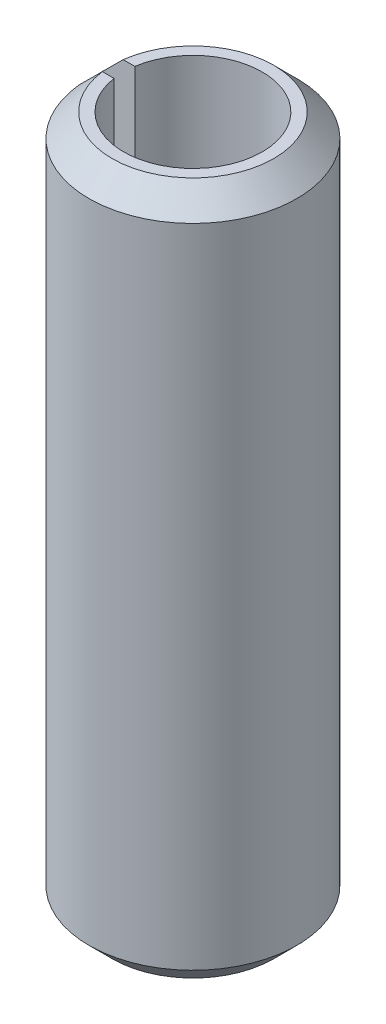
ISO-10303-21;
HEADER;
FILE_DESCRIPTION(('STEP AP214'),'2;1');
FILE_NAME('part.step','',(''),(''),'','','');
FILE_SCHEMA(('AUTOMOTIVE_DESIGN { 1 0 10303 214 1 1 1 1 }'));
ENDSEC;
DATA;
#1=APPLICATION_CONTEXT('core data for automotive mechanical design processes');
#2=APPLICATION_PROTOCOL_DEFINITION('international standard','automotive_design',2000,#1);
#3=PRODUCT_CONTEXT('',#1,'mechanical');
#4=PRODUCT('Part','Part','',(#3));
#5=PRODUCT_RELATED_PRODUCT_CATEGORY('part','',(#4));
#6=PRODUCT_DEFINITION_FORMATION('','',#4);
#7=PRODUCT_DEFINITION_CONTEXT('part definition',#1,'design');
#8=PRODUCT_DEFINITION('design','',#6,#7);
#9=PRODUCT_DEFINITION_SHAPE('','',#8);
#10=(LENGTH_UNIT() NAMED_UNIT(*) SI_UNIT(.MILLI.,.METRE.));
#11=(NAMED_UNIT(*) PLANE_ANGLE_UNIT() SI_UNIT($,.RADIAN.));
#12=(NAMED_UNIT(*) SI_UNIT($,.STERADIAN.) SOLID_ANGLE_UNIT());
#13=UNCERTAINTY_MEASURE_WITH_UNIT(LENGTH_MEASURE(1.E-05),#10,'distance_accuracy_value','');
#14=(GEOMETRIC_REPRESENTATION_CONTEXT(3) GLOBAL_UNCERTAINTY_ASSIGNED_CONTEXT((#13)) GLOBAL_UNIT_ASSIGNED_CONTEXT((#10,
#11,#12)) REPRESENTATION_CONTEXT('',''));
#15=CARTESIAN_POINT('',(0.,0.,0.));
#16=DIRECTION('',(0.,0.,1.));
#17=DIRECTION('',(1.,0.,0.));
#18=AXIS2_PLACEMENT_3D('',#15,#16,#17);
#19=CARTESIAN_POINT('',(2.,10.,0.));
#20=DIRECTION('',(0.,-1.,0.));
#21=DIRECTION('',(0.,0.,-1.));
#22=AXIS2_PLACEMENT_3D('',#19,#20,#21);
#23=PLANE('',#22);
#24=CARTESIAN_POINT('',(0.,10.,0.));
#25=DIRECTION('',(0.,-1.,0.));
#26=DIRECTION('',(0.,0.,-1.));
#27=AXIS2_PLACEMENT_3D('',#24,#25,#26);
#28=CIRCLE('',#27,2.33333333333333);
#29=CARTESIAN_POINT('',(-2.31396725224115,10.,0.3));
#30=VERTEX_POINT('',#29);
#31=CARTESIAN_POINT('',(-2.31396725224115,10.,-0.3));
#32=VERTEX_POINT('',#31);
#33=EDGE_CURVE('E111',#30,#32,#28,.F.);
#34=ORIENTED_EDGE('',*,*,#33,.T.);
#35=DIRECTION('',(-1.,0.,0.));
#36=VECTOR('',#35,1.);
#37=CARTESIAN_POINT('',(0.,10.,-0.3));
#38=LINE('',#37,#36);
#39=CARTESIAN_POINT('',(-1.97737199332852,10.,-0.3));
#40=VERTEX_POINT('',#39);
#41=EDGE_CURVE('E161',#40,#32,#38,.T.);
#42=ORIENTED_EDGE('',*,*,#41,.F.);
#43=CARTESIAN_POINT('',(0.,10.,0.));
#44=DIRECTION('',(0.,1.,0.));
#45=DIRECTION('',(0.,0.,1.));
#46=AXIS2_PLACEMENT_3D('',#43,#44,#45);
#47=CIRCLE('',#46,2.);
#48=CARTESIAN_POINT('',(-1.97737199332852,10.,0.3));
#49=VERTEX_POINT('',#48);
#50=EDGE_CURVE('E107',#49,#40,#47,.T.);
#51=ORIENTED_EDGE('',*,*,#50,.F.);
#52=DIRECTION('',(1.,0.,0.));
#53=VECTOR('',#52,1.);
#54=CARTESIAN_POINT('',(0.,10.,0.3));
#55=LINE('',#54,#53);
#56=EDGE_CURVE('E98',#30,#49,#55,.T.);
#57=ORIENTED_EDGE('',*,*,#56,.F.);
#58=EDGE_LOOP('',(#34,#42,#51,#57));
#59=FACE_BOUND('',#58,.T.);
#60=ADVANCED_FACE('F34',(#59),#23,.F.);
#61=CARTESIAN_POINT('',(0.,10.,0.));
#62=DIRECTION('',(0.,1.,0.));
#63=DIRECTION('',(0.,0.,1.));
#64=AXIS2_PLACEMENT_3D('',#61,#62,#63);
#65=CYLINDRICAL_SURFACE('',#64,3.);
#66=CARTESIAN_POINT('',(0.,-9.33333333333333,0.));
#67=DIRECTION('',(0.,1.,0.));
#68=DIRECTION('',(0.,0.,1.));
#69=AXIS2_PLACEMENT_3D('',#66,#67,#68);
#70=CIRCLE('',#69,3.);
#71=CARTESIAN_POINT('',(-2.98496231131986,-9.33333333333333,0.3));
#72=VERTEX_POINT('',#71);
#73=CARTESIAN_POINT('',(-2.98496231131986,-9.33333333333333,-0.3));
#74=VERTEX_POINT('',#73);
#75=EDGE_CURVE('E114',#72,#74,#70,.T.);
#76=ORIENTED_EDGE('',*,*,#75,.T.);
#77=DIRECTION('',(0.,1.,0.));
#78=VECTOR('',#77,1.);
#79=CARTESIAN_POINT('',(-2.98496231131986,10.,-0.3));
#80=LINE('',#79,#78);
#81=CARTESIAN_POINT('',(-2.98496231131986,9.33333333333333,-0.3));
#82=VERTEX_POINT('',#81);
#83=EDGE_CURVE('E53',#74,#82,#80,.T.);
#84=ORIENTED_EDGE('',*,*,#83,.T.);
#85=CARTESIAN_POINT('',(0.,9.33333333333333,0.));
#86=DIRECTION('',(0.,-1.,0.));
#87=DIRECTION('',(0.,0.,-1.));
#88=AXIS2_PLACEMENT_3D('',#85,#86,#87);
#89=CIRCLE('',#88,3.);
#90=CARTESIAN_POINT('',(-2.98496231131986,9.33333333333333,0.3));
#91=VERTEX_POINT('',#90);
#92=EDGE_CURVE('E120',#82,#91,#89,.T.);
#93=ORIENTED_EDGE('',*,*,#92,.T.);
#94=DIRECTION('',(0.,1.,0.));
#95=VECTOR('',#94,1.);
#96=CARTESIAN_POINT('',(-2.98496231131986,10.,0.3));
#97=LINE('',#96,#95);
#98=EDGE_CURVE('E142',#91,#72,#97,.F.);
#99=ORIENTED_EDGE('',*,*,#98,.T.);
#100=EDGE_LOOP('',(#76,#84,#93,#99));
#101=FACE_BOUND('',#100,.T.);
#102=ADVANCED_FACE('F167',(#101),#65,.T.);
#103=CARTESIAN_POINT('',(3.,-10.,0.));
#104=DIRECTION('',(0.,1.,0.));
#105=DIRECTION('',(0.,0.,1.));
#106=AXIS2_PLACEMENT_3D('',#103,#104,#105);
#107=PLANE('',#106);
#108=CARTESIAN_POINT('',(0.,-10.,0.));
#109=DIRECTION('',(0.,1.,0.));
#110=DIRECTION('',(0.,0.,1.));
#111=AXIS2_PLACEMENT_3D('',#108,#109,#110);
#112=CIRCLE('',#111,2.);
#113=CARTESIAN_POINT('',(-1.97737199332852,-10.,0.3));
#114=VERTEX_POINT('',#113);
#115=CARTESIAN_POINT('',(-1.97737199332852,-10.,-0.3));
#116=VERTEX_POINT('',#115);
#117=EDGE_CURVE('E105',#114,#116,#112,.T.);
#118=ORIENTED_EDGE('',*,*,#117,.T.);
#119=DIRECTION('',(-1.,0.,0.));
#120=VECTOR('',#119,1.);
#121=CARTESIAN_POINT('',(0.,-10.,-0.3));
#122=LINE('',#121,#120);
#123=CARTESIAN_POINT('',(-2.31396725224114,-10.,-0.3));
#124=VERTEX_POINT('',#123);
#125=EDGE_CURVE('E89',#116,#124,#122,.T.);
#126=ORIENTED_EDGE('',*,*,#125,.T.);
#127=CARTESIAN_POINT('',(0.,-10.,0.));
#128=DIRECTION('',(0.,1.,0.));
#129=DIRECTION('',(0.,0.,1.));
#130=AXIS2_PLACEMENT_3D('',#127,#128,#129);
#131=CIRCLE('',#130,2.33333333333333);
#132=CARTESIAN_POINT('',(-2.31396725224114,-10.,0.3));
#133=VERTEX_POINT('',#132);
#134=EDGE_CURVE('E123',#124,#133,#131,.F.);
#135=ORIENTED_EDGE('',*,*,#134,.T.);
#136=DIRECTION('',(1.,0.,0.));
#137=VECTOR('',#136,1.);
#138=CARTESIAN_POINT('',(0.,-10.,0.3));
#139=LINE('',#138,#137);
#140=EDGE_CURVE('E61',#133,#114,#139,.T.);
#141=ORIENTED_EDGE('',*,*,#140,.T.);
#142=EDGE_LOOP('',(#118,#126,#135,#141));
#143=FACE_BOUND('',#142,.T.);
#144=ADVANCED_FACE('F110',(#143),#107,.F.);
#145=CARTESIAN_POINT('',(0.,10.,0.));
#146=DIRECTION('',(0.,1.,0.));
#147=DIRECTION('',(0.,0.,1.));
#148=AXIS2_PLACEMENT_3D('',#145,#146,#147);
#149=CYLINDRICAL_SURFACE('',#148,2.);
#150=ORIENTED_EDGE('',*,*,#50,.T.);
#151=DIRECTION('',(0.,1.,0.));
#152=VECTOR('',#151,1.);
#153=CARTESIAN_POINT('',(-1.97737199332852,10.,-0.3));
#154=LINE('',#153,#152);
#155=EDGE_CURVE('E92',#40,#116,#154,.F.);
#156=ORIENTED_EDGE('',*,*,#155,.T.);
#157=ORIENTED_EDGE('',*,*,#117,.F.);
#158=DIRECTION('',(0.,1.,0.));
#159=VECTOR('',#158,1.);
#160=CARTESIAN_POINT('',(-1.97737199332852,10.,0.3));
#161=LINE('',#160,#159);
#162=EDGE_CURVE('E141',#114,#49,#161,.T.);
#163=ORIENTED_EDGE('',*,*,#162,.T.);
#164=EDGE_LOOP('',(#150,#156,#157,#163));
#165=FACE_BOUND('',#164,.T.);
#166=ADVANCED_FACE('F103',(#165),#149,.F.);
#167=CARTESIAN_POINT('',(0.,10.,0.));
#168=DIRECTION('',(0.,-1.,0.));
#169=DIRECTION('',(0.,0.,-1.));
#170=AXIS2_PLACEMENT_3D('',#167,#168,#169);
#171=CONICAL_SURFACE('',#170,2.33333333333333,0.785398163397447);
#172=CARTESIAN_POINT('',(-0.396691641849987,11.8359760586166,-0.3));
#173=CARTESIAN_POINT('',(-0.415710442544804,11.8207951156941,-0.3));
#174=CARTESIAN_POINT('',(-0.434545305922699,11.8053883420681,-0.3));
#175=CARTESIAN_POINT('',(-0.471921092021415,11.774226655868,-0.3));
#176=CARTESIAN_POINT('',(-0.490462053368463,11.7584717897047,-0.3));
#177=CARTESIAN_POINT('',(-0.545749728417863,11.7108450901463,-0.3));
#178=CARTESIAN_POINT('',(-0.582174229450623,11.6786005580013,-0.3));
#179=CARTESIAN_POINT('',(-0.654481105811685,11.6135420397666,-0.3));
#180=CARTESIAN_POINT('',(-0.690363688883504,11.580728282816,-0.3));
#181=CARTESIAN_POINT('',(-0.761783051490791,11.514719062787,-0.3));
#182=CARTESIAN_POINT('',(-0.797319790978148,11.4815235564512,-0.3));
#183=CARTESIAN_POINT('',(-0.90940734835268,11.3760800093661,-0.3));
#184=CARTESIAN_POINT('',(-0.9855258486054,11.3033733790761,-0.3));
#185=CARTESIAN_POINT('',(-1.13721263824695,11.1573878763704,-0.3));
#186=CARTESIAN_POINT('',(-1.21278091388571,11.0841089897483,-0.3));
#187=CARTESIAN_POINT('',(-1.43901501770103,10.8637908164948,-0.3));
#188=CARTESIAN_POINT('',(-1.58921089074383,10.7162692812486,-0.3));
#189=CARTESIAN_POINT('',(-1.88920528336474,10.4206128098025,-0.3));
#190=CARTESIAN_POINT('',(-2.0390034459924,10.272477513039,-0.3));
#191=CARTESIAN_POINT('',(-2.3383233202977,9.97593275341402,-0.3));
#192=CARTESIAN_POINT('',(-2.4878450366432,9.82752329526806,-0.3));
#193=CARTESIAN_POINT('',(-2.82121021974059,9.49629260228929,-0.3));
#194=CARTESIAN_POINT('',(-3.00501381207356,9.31343127593677,-0.3));
#195=CARTESIAN_POINT('',(-3.37248742703612,8.94757211088701,-0.3));
#196=CARTESIAN_POINT('',(-3.55615744880257,8.76457427132283,-0.3));
#197=CARTESIAN_POINT('',(-3.92322849028451,8.39867890361921,-0.3));
#198=CARTESIAN_POINT('',(-4.10662959454422,8.21578146027513,-0.3));
#199=CARTESIAN_POINT('',(-4.47337250984641,7.84992967162319,-0.3));
#200=CARTESIAN_POINT('',(-4.6567143212905,7.66697532671794,-0.3));
#201=CARTESIAN_POINT('',(-4.84003998644652,7.48400481585782,-0.3));
#202=B_SPLINE_CURVE_WITH_KNOTS('',3,(#172,#173,#174,#175,#176,#177,#178,#179,#180,#181,#182,
#183,#184,#185,#186,#187,#188,#189,#190,#191,#192,#193,#194,#195,#196,#197,#198,#199,#200,#201),
.UNSPECIFIED.,.F.,.F.,(4,2,2,2,2,2,2,2,2,2,2,2,2,2,4),(0.,0.0729980751688486,0.145986475627374,
0.291912989694833,0.437782065450063,0.583667836282376,0.899448949933818,1.21523792803044,
1.8468126948339,2.47883496482001,3.1108464636669,3.88866272697381,4.66648397263536,
5.44352125628224,6.2205531617089),.UNSPECIFIED.);
#203=EDGE_CURVE('E108',#32,#82,#202,.T.);
#204=ORIENTED_EDGE('',*,*,#203,.F.);
#205=ORIENTED_EDGE('',*,*,#33,.F.);
#206=CARTESIAN_POINT('',(-4.84003998644652,7.48400481585782,0.3));
#207=CARTESIAN_POINT('',(-4.65661166983822,7.66707762611222,0.3));
#208=CARTESIAN_POINT('',(-4.47316729946414,7.85013437041129,0.3));
#209=CARTESIAN_POINT('',(-4.10622546332719,8.21618461855336,0.3));
#210=CARTESIAN_POINT('',(-3.92272799914974,8.39917812398572,0.3));
#211=CARTESIAN_POINT('',(-3.55566279037501,8.76506701356655,0.3));
#212=CARTESIAN_POINT('',(-3.37209505210493,8.9479624040621,0.3));
#213=CARTESIAN_POINT('',(-3.00482090267688,9.31362369394764,0.3));
#214=CARTESIAN_POINT('',(-2.82111448797139,9.49638958977595,0.3));
#215=CARTESIAN_POINT('',(-2.54536236794638,9.77037330481986,0.3));
#216=CARTESIAN_POINT('',(-2.45340575586346,9.86168077976633,0.3));
#217=CARTESIAN_POINT('',(-2.26940960484188,10.0442102220244,0.3));
#218=CARTESIAN_POINT('',(-2.17737006678163,10.1354321902212,0.3));
#219=CARTESIAN_POINT('',(-1.99317828428106,10.3177473756332,0.3));
#220=CARTESIAN_POINT('',(-1.90102604959158,10.4088406026945,0.3));
#221=CARTESIAN_POINT('',(-1.71653521416962,10.5908450855826,0.3));
#222=CARTESIAN_POINT('',(-1.62419660658486,10.6817563344646,0.3));
#223=CARTESIAN_POINT('',(-1.43920140486478,10.8633069986035,0.3));
#224=CARTESIAN_POINT('',(-1.34654472924561,10.9539463309988,0.3));
#225=CARTESIAN_POINT('',(-1.20716868742077,11.0894915879573,0.3));
#226=CARTESIAN_POINT('',(-1.16064781788948,11.1346015166217,0.3));
#227=CARTESIAN_POINT('',(-1.06741554452681,11.224627968537,0.3));
#228=CARTESIAN_POINT('',(-1.02070413330827,11.2695444841479,0.3));
#229=CARTESIAN_POINT('',(-0.926985622564411,11.3591095758161,0.3));
#230=CARTESIAN_POINT('',(-0.879978402076291,11.4037580254008,0.3));
#231=CARTESIAN_POINT('',(-0.785547702947314,11.4926043735142,0.3));
#232=CARTESIAN_POINT('',(-0.73812427015481,11.5368023205373,0.3));
#233=CARTESIAN_POINT('',(-0.666448951732278,11.6025358600644,0.3));
#234=CARTESIAN_POINT('',(-0.642460918100559,11.6243586774786,0.3));
#235=CARTESIAN_POINT('',(-0.594246640374244,11.6677369343593,0.3));
#236=CARTESIAN_POINT('',(-0.570020410298657,11.6892923893946,0.3));
#237=CARTESIAN_POINT('',(-0.521236271316189,11.7320465523289,0.3));
#238=CARTESIAN_POINT('',(-0.496678237792463,11.7532451190751,0.3));
#239=CARTESIAN_POINT('',(-0.447082056781348,11.7950819333039,0.3));
#240=CARTESIAN_POINT('',(-0.422043811893213,11.8157200650187,0.3));
#241=CARTESIAN_POINT('',(-0.396691641849987,11.8359760586166,0.3));
#242=B_SPLINE_CURVE_WITH_KNOTS('',3,(#206,#207,#208,#209,#210,#211,#212,#213,#214,#215,#216,
#217,#218,#219,#220,#221,#222,#223,#224,#225,#226,#227,#228,#229,#230,#231,#232,#233,#234,#235,
#236,#237,#238,#239,#240,#241),.UNSPECIFIED.,.F.,.F.,(4,2,2,2,2,2,2,2,2,2,2,2,2,2,2,2,2,4),(0.,
0.777466682643027,1.55491215039541,2.33229911905273,3.10970669808068,3.49847093359981,
3.88723109831565,4.27595971937198,4.66470290288618,5.05355447767748,5.2479554446632,
5.44236402147155,5.63685806419796,5.83133094459473,5.92861738853459,6.02589814057093,
6.12321650465721,6.22055482096147),.UNSPECIFIED.);
#243=EDGE_CURVE('E135',#91,#30,#242,.T.);
#244=ORIENTED_EDGE('',*,*,#243,.F.);
#245=ORIENTED_EDGE('',*,*,#92,.F.);
#246=EDGE_LOOP('',(#204,#205,#244,#245));
#247=FACE_BOUND('',#246,.T.);
#248=ADVANCED_FACE('F145',(#247),#171,.T.);
#249=CARTESIAN_POINT('',(0.,-9.33333333333333,0.));
#250=DIRECTION('',(0.,1.,0.));
#251=DIRECTION('',(0.,0.,1.));
#252=AXIS2_PLACEMENT_3D('',#249,#250,#251);
#253=CONICAL_SURFACE('',#252,3.,0.785398163397451);
#254=CARTESIAN_POINT('',(-4.84003998644652,-7.48400481585783,-0.3));
#255=CARTESIAN_POINT('',(-4.65661166983822,-7.66707762611223,-0.3));
#256=CARTESIAN_POINT('',(-4.47316729946414,-7.8501343704113,-0.3));
#257=CARTESIAN_POINT('',(-4.10622546332719,-8.21618461855337,-0.3));
#258=CARTESIAN_POINT('',(-3.92272799914974,-8.39917812398572,-0.3));
#259=CARTESIAN_POINT('',(-3.55566279037501,-8.76506701356655,-0.3));
#260=CARTESIAN_POINT('',(-3.37209505210493,-8.9479624040621,-0.3));
#261=CARTESIAN_POINT('',(-3.00482090267688,-9.31362369394764,-0.3));
#262=CARTESIAN_POINT('',(-2.82111448797139,-9.49638958977595,-0.3));
#263=CARTESIAN_POINT('',(-2.54536236794638,-9.77037330481986,-0.3));
#264=CARTESIAN_POINT('',(-2.45340575586347,-9.86168077976633,-0.3));
#265=CARTESIAN_POINT('',(-2.26940960484188,-10.0442102220243,-0.3));
#266=CARTESIAN_POINT('',(-2.17737006678163,-10.1354321902212,-0.3));
#267=CARTESIAN_POINT('',(-1.99317828428106,-10.3177473756332,-0.3));
#268=CARTESIAN_POINT('',(-1.90102604959158,-10.4088406026945,-0.3));
#269=CARTESIAN_POINT('',(-1.71653521416962,-10.5908450855825,-0.3));
#270=CARTESIAN_POINT('',(-1.62419660658486,-10.6817563344646,-0.3));
#271=CARTESIAN_POINT('',(-1.43920140486478,-10.8633069986035,-0.3));
#272=CARTESIAN_POINT('',(-1.3465447292456,-10.9539463309987,-0.3));
#273=CARTESIAN_POINT('',(-1.20716868742077,-11.0894915879573,-0.3));
#274=CARTESIAN_POINT('',(-1.16064781788948,-11.1346015166217,-0.3));
#275=CARTESIAN_POINT('',(-1.06741554452681,-11.224627968537,-0.3));
#276=CARTESIAN_POINT('',(-1.02070413330827,-11.2695444841479,-0.3));
#277=CARTESIAN_POINT('',(-0.926985622564408,-11.3591095758161,-0.3));
#278=CARTESIAN_POINT('',(-0.879978402076288,-11.4037580254008,-0.3));
#279=CARTESIAN_POINT('',(-0.78554770294731,-11.4926043735142,-0.3));
#280=CARTESIAN_POINT('',(-0.738124270154806,-11.5368023205373,-0.3));
#281=CARTESIAN_POINT('',(-0.666448951732274,-11.6025358600644,-0.3));
#282=CARTESIAN_POINT('',(-0.642460918100554,-11.6243586774786,-0.3));
#283=CARTESIAN_POINT('',(-0.59424664037424,-11.6677369343593,-0.3));
#284=CARTESIAN_POINT('',(-0.570020410298652,-11.6892923893946,-0.3));
#285=CARTESIAN_POINT('',(-0.521236271316184,-11.7320465523289,-0.3));
#286=CARTESIAN_POINT('',(-0.496678237792458,-11.7532451190751,-0.3));
#287=CARTESIAN_POINT('',(-0.447082056781342,-11.7950819333038,-0.3));
#288=CARTESIAN_POINT('',(-0.422043811893207,-11.8157200650187,-0.3));
#289=CARTESIAN_POINT('',(-0.39669164184998,-11.8359760586166,-0.3));
#290=B_SPLINE_CURVE_WITH_KNOTS('',3,(#254,#255,#256,#257,#258,#259,#260,#261,#262,#263,#264,
#265,#266,#267,#268,#269,#270,#271,#272,#273,#274,#275,#276,#277,#278,#279,#280,#281,#282,#283,
#284,#285,#286,#287,#288,#289),.UNSPECIFIED.,.F.,.F.,(4,2,2,2,2,2,2,2,2,2,2,2,2,2,2,2,2,4),(0.,
0.777466682643026,1.55491215039541,2.33229911905273,3.10970669808068,3.4984709335998,
3.88723109831564,4.27595971937197,4.66470290288617,5.05355447767747,5.24795544466319,
5.44236402147154,5.63685806419795,5.83133094459471,5.92861738853458,6.02589814057092,
6.1232165046572,6.22055482096146),.UNSPECIFIED.);
#291=EDGE_CURVE('E11',#74,#124,#290,.T.);
#292=ORIENTED_EDGE('',*,*,#291,.F.);
#293=ORIENTED_EDGE('',*,*,#75,.F.);
#294=CARTESIAN_POINT('',(-0.39669164184998,-11.8359760586166,0.3));
#295=CARTESIAN_POINT('',(-0.415710442544798,-11.8207951156941,0.3));
#296=CARTESIAN_POINT('',(-0.434545305922691,-11.8053883420681,0.3));
#297=CARTESIAN_POINT('',(-0.471921092021407,-11.774226655868,0.3));
#298=CARTESIAN_POINT('',(-0.490462053368456,-11.7584717897047,0.3));
#299=CARTESIAN_POINT('',(-0.545749728417855,-11.7108450901463,0.3));
#300=CARTESIAN_POINT('',(-0.582174229450614,-11.6786005580013,0.3));
#301=CARTESIAN_POINT('',(-0.654481105811677,-11.6135420397666,0.3));
#302=CARTESIAN_POINT('',(-0.690363688883495,-11.580728282816,0.3));
#303=CARTESIAN_POINT('',(-0.761783051490781,-11.514719062787,0.3));
#304=CARTESIAN_POINT('',(-0.797319790978138,-11.4815235564512,0.3));
#305=CARTESIAN_POINT('',(-0.90940734835267,-11.3760800093661,0.3));
#306=CARTESIAN_POINT('',(-0.985525848605391,-11.3033733790761,0.3));
#307=CARTESIAN_POINT('',(-1.13721263824694,-11.1573878763704,0.3));
#308=CARTESIAN_POINT('',(-1.2127809138857,-11.0841089897483,0.3));
#309=CARTESIAN_POINT('',(-1.43901501770103,-10.8637908164948,0.3));
#310=CARTESIAN_POINT('',(-1.58921089074382,-10.7162692812486,0.3));
#311=CARTESIAN_POINT('',(-1.88920528336473,-10.4206128098025,0.3));
#312=CARTESIAN_POINT('',(-2.03900344599239,-10.272477513039,0.3));
#313=CARTESIAN_POINT('',(-2.3383233202977,-9.97593275341402,0.3));
#314=CARTESIAN_POINT('',(-2.4878450366432,-9.82752329526806,0.3));
#315=CARTESIAN_POINT('',(-2.82121021974059,-9.4962926022893,0.3));
#316=CARTESIAN_POINT('',(-3.00501381207356,-9.31343127593677,0.3));
#317=CARTESIAN_POINT('',(-3.37248742703612,-8.94757211088701,0.3));
#318=CARTESIAN_POINT('',(-3.55615744880257,-8.76457427132283,0.3));
#319=CARTESIAN_POINT('',(-3.92322849028452,-8.39867890361922,0.3));
#320=CARTESIAN_POINT('',(-4.10662959454423,-8.21578146027513,0.3));
#321=CARTESIAN_POINT('',(-4.47337250984642,-7.84992967162319,0.3));
#322=CARTESIAN_POINT('',(-4.6567143212905,-7.66697532671795,0.3));
#323=CARTESIAN_POINT('',(-4.84003998644652,-7.48400481585783,0.3));
#324=B_SPLINE_CURVE_WITH_KNOTS('',3,(#294,#295,#296,#297,#298,#299,#300,#301,#302,#303,#304,
#305,#306,#307,#308,#309,#310,#311,#312,#313,#314,#315,#316,#317,#318,#319,#320,#321,#322,#323),
.UNSPECIFIED.,.F.,.F.,(4,2,2,2,2,2,2,2,2,2,2,2,2,2,4),(0.,0.0729980751688466,0.145986475627372,
0.291912989694829,0.437782065450058,0.583667836282368,0.899448949933812,1.21523792803044,
1.8468126948339,2.47883496482,3.11084646366689,3.88866272697381,4.66648397263535,
5.44352125628224,6.22055316170889),.UNSPECIFIED.);
#325=EDGE_CURVE('E47',#133,#72,#324,.T.);
#326=ORIENTED_EDGE('',*,*,#325,.F.);
#327=ORIENTED_EDGE('',*,*,#134,.F.);
#328=EDGE_LOOP('',(#292,#293,#326,#327));
#329=FACE_BOUND('',#328,.T.);
#330=ADVANCED_FACE('F36',(#329),#253,.T.);
#331=CARTESIAN_POINT('',(0.,-10.,0.3));
#332=DIRECTION('',(0.,0.,1.));
#333=DIRECTION('',(1.,0.,0.));
#334=AXIS2_PLACEMENT_3D('',#331,#332,#333);
#335=PLANE('',#334);
#336=ORIENTED_EDGE('',*,*,#140,.F.);
#337=ORIENTED_EDGE('',*,*,#325,.T.);
#338=ORIENTED_EDGE('',*,*,#98,.F.);
#339=ORIENTED_EDGE('',*,*,#243,.T.);
#340=ORIENTED_EDGE('',*,*,#56,.T.);
#341=ORIENTED_EDGE('',*,*,#162,.F.);
#342=EDGE_LOOP('',(#336,#337,#338,#339,#340,#341));
#343=FACE_BOUND('',#342,.T.);
#344=ADVANCED_FACE('F128',(#343),#335,.F.);
#345=CARTESIAN_POINT('',(0.,-10.,-0.3));
#346=DIRECTION('',(0.,0.,-1.));
#347=DIRECTION('',(-1.,0.,0.));
#348=AXIS2_PLACEMENT_3D('',#345,#346,#347);
#349=PLANE('',#348);
#350=ORIENTED_EDGE('',*,*,#41,.T.);
#351=ORIENTED_EDGE('',*,*,#203,.T.);
#352=ORIENTED_EDGE('',*,*,#83,.F.);
#353=ORIENTED_EDGE('',*,*,#291,.T.);
#354=ORIENTED_EDGE('',*,*,#125,.F.);
#355=ORIENTED_EDGE('',*,*,#155,.F.);
#356=EDGE_LOOP('',(#350,#351,#352,#353,#354,#355));
#357=FACE_BOUND('',#356,.T.);
#358=ADVANCED_FACE('F91',(#357),#349,.F.);
#359=CLOSED_SHELL('',(#60,#102,#144,#166,#248,#330,#344,#358));
#360=MANIFOLD_SOLID_BREP('B2',#359);
#361=ADVANCED_BREP_SHAPE_REPRESENTATION('',(#18,#360),#14);
#362=SHAPE_DEFINITION_REPRESENTATION(#9,#361);
ENDSEC;
END-ISO-10303-21;
